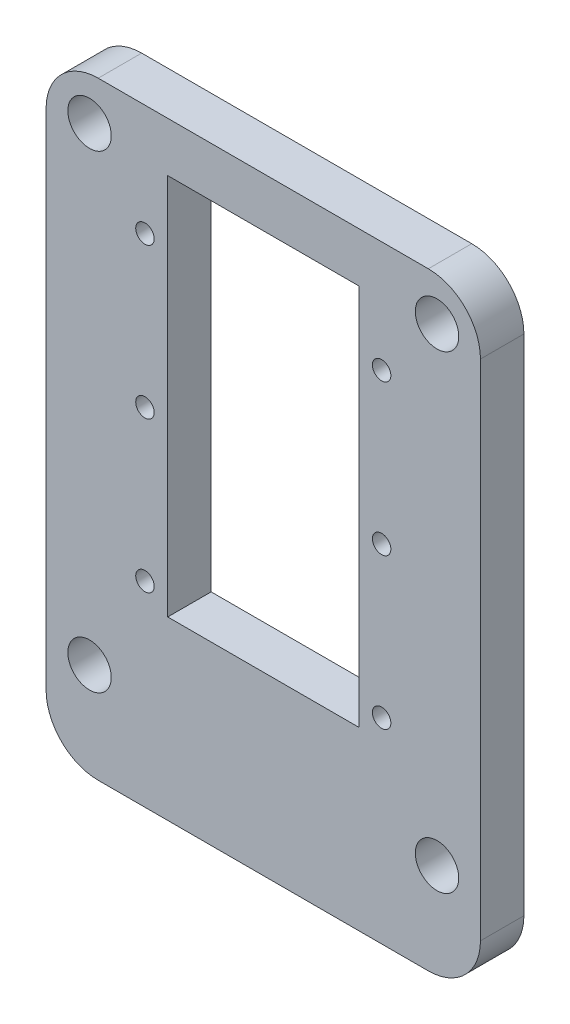
ISO-10303-21;
HEADER;
FILE_DESCRIPTION(('STEP AP214'),'2;1');
FILE_NAME('part.step','',(''),(''),'','','');
FILE_SCHEMA(('AUTOMOTIVE_DESIGN { 1 0 10303 214 1 1 1 1 }'));
ENDSEC;
DATA;
#1=APPLICATION_CONTEXT('core data for automotive mechanical design processes');
#2=APPLICATION_PROTOCOL_DEFINITION('international standard','automotive_design',2000,#1);
#3=PRODUCT_CONTEXT('',#1,'mechanical');
#4=PRODUCT('Part','Part','',(#3));
#5=PRODUCT_RELATED_PRODUCT_CATEGORY('part','',(#4));
#6=PRODUCT_DEFINITION_FORMATION('','',#4);
#7=PRODUCT_DEFINITION_CONTEXT('part definition',#1,'design');
#8=PRODUCT_DEFINITION('design','',#6,#7);
#9=PRODUCT_DEFINITION_SHAPE('','',#8);
#10=(LENGTH_UNIT() NAMED_UNIT(*) SI_UNIT(.MILLI.,.METRE.));
#11=(NAMED_UNIT(*) PLANE_ANGLE_UNIT() SI_UNIT($,.RADIAN.));
#12=(NAMED_UNIT(*) SI_UNIT($,.STERADIAN.) SOLID_ANGLE_UNIT());
#13=UNCERTAINTY_MEASURE_WITH_UNIT(LENGTH_MEASURE(1.E-05),#10,'distance_accuracy_value','');
#14=(GEOMETRIC_REPRESENTATION_CONTEXT(3) GLOBAL_UNCERTAINTY_ASSIGNED_CONTEXT((#13)) GLOBAL_UNIT_ASSIGNED_CONTEXT((#10,
#11,#12)) REPRESENTATION_CONTEXT('',''));
#15=CARTESIAN_POINT('',(0.,0.,0.));
#16=DIRECTION('',(0.,0.,1.));
#17=DIRECTION('',(1.,0.,0.));
#18=AXIS2_PLACEMENT_3D('',#15,#16,#17);
#19=CARTESIAN_POINT('',(-18.1,-22.0973062704397,-6.35));
#20=DIRECTION('',(0.,0.,-1.));
#21=DIRECTION('',(-1.,0.,0.));
#22=AXIS2_PLACEMENT_3D('',#19,#20,#21);
#23=PLANE('',#22);
#24=CARTESIAN_POINT('',(25.4,31.8547845003731,-6.35));
#25=DIRECTION('',(0.,0.,-1.));
#26=DIRECTION('',(-1.,0.,0.));
#27=AXIS2_PLACEMENT_3D('',#24,#25,#26);
#28=CIRCLE('',#27,3.175);
#29=CARTESIAN_POINT('',(22.225,31.8547845003731,-6.35));
#30=VERTEX_POINT('',#29);
#31=EDGE_CURVE('E553',#30,#30,#28,.T.);
#32=ORIENTED_EDGE('',*,*,#31,.F.);
#33=EDGE_LOOP('',(#32));
#34=FACE_BOUND('',#33,.T.);
#35=CARTESIAN_POINT('',(25.3999999999993,-36.7252154996269,-6.35));
#36=DIRECTION('',(0.,0.,-1.));
#37=DIRECTION('',(-1.,0.,0.));
#38=AXIS2_PLACEMENT_3D('',#35,#36,#37);
#39=CIRCLE('',#38,3.175);
#40=CARTESIAN_POINT('',(22.2249999999993,-36.7252154996269,-6.35));
#41=VERTEX_POINT('',#40);
#42=EDGE_CURVE('E562',#41,#41,#39,.T.);
#43=ORIENTED_EDGE('',*,*,#42,.F.);
#44=EDGE_LOOP('',(#43));
#45=FACE_BOUND('',#44,.T.);
#46=CARTESIAN_POINT('',(-25.4000000000007,-36.7252154996265,-6.35));
#47=DIRECTION('',(0.,0.,-1.));
#48=DIRECTION('',(-1.,0.,0.));
#49=AXIS2_PLACEMENT_3D('',#46,#47,#48);
#50=CIRCLE('',#49,3.175);
#51=CARTESIAN_POINT('',(-28.5750000000007,-36.7252154996265,-6.35));
#52=VERTEX_POINT('',#51);
#53=EDGE_CURVE('E568',#52,#52,#50,.T.);
#54=ORIENTED_EDGE('',*,*,#53,.F.);
#55=EDGE_LOOP('',(#54));
#56=FACE_BOUND('',#55,.T.);
#57=CARTESIAN_POINT('',(-25.4,31.8547845003735,-6.35));
#58=DIRECTION('',(0.,0.,-1.));
#59=DIRECTION('',(-1.,0.,0.));
#60=AXIS2_PLACEMENT_3D('',#57,#58,#59);
#61=CIRCLE('',#60,3.175);
#62=CARTESIAN_POINT('',(-28.575,31.8547845003735,-6.35));
#63=VERTEX_POINT('',#62);
#64=EDGE_CURVE('E153',#63,#63,#61,.T.);
#65=ORIENTED_EDGE('',*,*,#64,.F.);
#66=EDGE_LOOP('',(#65));
#67=FACE_BOUND('',#66,.T.);
#68=DIRECTION('',(0.,1.,0.));
#69=VECTOR('',#68,1.);
#70=CARTESIAN_POINT('',(13.97,30.9487845003735,-6.35));
#71=LINE('',#70,#69);
#72=CARTESIAN_POINT('',(13.97,-24.9312154996265,-6.35));
#73=VERTEX_POINT('',#72);
#74=CARTESIAN_POINT('',(13.97,30.9487845003735,-6.35));
#75=VERTEX_POINT('',#74);
#76=EDGE_CURVE('E127',#73,#75,#71,.T.);
#77=ORIENTED_EDGE('',*,*,#76,.T.);
#78=DIRECTION('',(-1.,0.,0.));
#79=VECTOR('',#78,1.);
#80=CARTESIAN_POINT('',(-13.97,30.9487845003735,-6.35));
#81=LINE('',#80,#79);
#82=CARTESIAN_POINT('',(-13.97,30.9487845003735,-6.35));
#83=VERTEX_POINT('',#82);
#84=EDGE_CURVE('E139',#75,#83,#81,.T.);
#85=ORIENTED_EDGE('',*,*,#84,.T.);
#86=DIRECTION('',(0.,-1.,0.));
#87=VECTOR('',#86,1.);
#88=CARTESIAN_POINT('',(-13.97,30.9487845003735,-6.35));
#89=LINE('',#88,#87);
#90=CARTESIAN_POINT('',(-13.97,-24.9312154996265,-6.35));
#91=VERTEX_POINT('',#90);
#92=EDGE_CURVE('E143',#83,#91,#89,.T.);
#93=ORIENTED_EDGE('',*,*,#92,.T.);
#94=DIRECTION('',(1.,0.,0.));
#95=VECTOR('',#94,1.);
#96=CARTESIAN_POINT('',(-13.97,-24.9312154996265,-6.35));
#97=LINE('',#96,#95);
#98=EDGE_CURVE('E135',#91,#73,#97,.T.);
#99=ORIENTED_EDGE('',*,*,#98,.T.);
#100=EDGE_LOOP('',(#77,#85,#93,#99));
#101=FACE_BOUND('',#100,.T.);
#102=CARTESIAN_POINT('',(-17.3,21.9487845003735,-6.35));
#103=DIRECTION('',(0.,0.,-1.));
#104=DIRECTION('',(-1.,0.,0.));
#105=AXIS2_PLACEMENT_3D('',#102,#103,#104);
#106=CIRCLE('',#105,1.35);
#107=CARTESIAN_POINT('',(-18.65,21.9487845003735,-6.35));
#108=VERTEX_POINT('',#107);
#109=EDGE_CURVE('E220',#108,#108,#106,.T.);
#110=ORIENTED_EDGE('',*,*,#109,.F.);
#111=EDGE_LOOP('',(#110));
#112=FACE_BOUND('',#111,.T.);
#113=CARTESIAN_POINT('',(-17.3,-0.0512154996265349,-6.35));
#114=DIRECTION('',(0.,0.,-1.));
#115=DIRECTION('',(-1.,0.,0.));
#116=AXIS2_PLACEMENT_3D('',#113,#114,#115);
#117=CIRCLE('',#116,1.35);
#118=CARTESIAN_POINT('',(-18.65,-0.0512154996265349,-6.35));
#119=VERTEX_POINT('',#118);
#120=EDGE_CURVE('E214',#119,#119,#117,.T.);
#121=ORIENTED_EDGE('',*,*,#120,.F.);
#122=EDGE_LOOP('',(#121));
#123=FACE_BOUND('',#122,.T.);
#124=CARTESIAN_POINT('',(-17.3,-22.0512154996265,-6.35));
#125=DIRECTION('',(0.,0.,-1.));
#126=DIRECTION('',(-1.,0.,0.));
#127=AXIS2_PLACEMENT_3D('',#124,#125,#126);
#128=CIRCLE('',#127,1.35);
#129=CARTESIAN_POINT('',(-18.65,-22.0512154996265,-6.35));
#130=VERTEX_POINT('',#129);
#131=EDGE_CURVE('E208',#130,#130,#128,.T.);
#132=ORIENTED_EDGE('',*,*,#131,.F.);
#133=EDGE_LOOP('',(#132));
#134=FACE_BOUND('',#133,.T.);
#135=CARTESIAN_POINT('',(17.3,-22.0512154996265,-6.35));
#136=DIRECTION('',(0.,0.,-1.));
#137=DIRECTION('',(1.,0.,0.));
#138=AXIS2_PLACEMENT_3D('',#135,#136,#137);
#139=CIRCLE('',#138,1.35);
#140=CARTESIAN_POINT('',(18.65,-22.0512154996265,-6.35));
#141=VERTEX_POINT('',#140);
#142=EDGE_CURVE('E202',#141,#141,#139,.T.);
#143=ORIENTED_EDGE('',*,*,#142,.F.);
#144=EDGE_LOOP('',(#143));
#145=FACE_BOUND('',#144,.T.);
#146=CARTESIAN_POINT('',(17.3,-0.0512154996265349,-6.35));
#147=DIRECTION('',(0.,0.,-1.));
#148=DIRECTION('',(1.,0.,0.));
#149=AXIS2_PLACEMENT_3D('',#146,#147,#148);
#150=CIRCLE('',#149,1.35);
#151=CARTESIAN_POINT('',(18.65,-0.0512154996265349,-6.35));
#152=VERTEX_POINT('',#151);
#153=EDGE_CURVE('E196',#152,#152,#150,.T.);
#154=ORIENTED_EDGE('',*,*,#153,.F.);
#155=EDGE_LOOP('',(#154));
#156=FACE_BOUND('',#155,.T.);
#157=CARTESIAN_POINT('',(17.3,21.9487845003735,-6.35));
#158=DIRECTION('',(0.,0.,-1.));
#159=DIRECTION('',(1.,0.,0.));
#160=AXIS2_PLACEMENT_3D('',#157,#158,#159);
#161=CIRCLE('',#160,1.35);
#162=CARTESIAN_POINT('',(18.65,21.9487845003735,-6.35));
#163=VERTEX_POINT('',#162);
#164=EDGE_CURVE('E182',#163,#163,#161,.T.);
#165=ORIENTED_EDGE('',*,*,#164,.F.);
#166=EDGE_LOOP('',(#165));
#167=FACE_BOUND('',#166,.T.);
#168=DIRECTION('',(-1.,0.,0.));
#169=VECTOR('',#168,1.);
#170=CARTESIAN_POINT('',(31.75,-50.6952154996265,-6.35));
#171=LINE('',#170,#169);
#172=CARTESIAN_POINT('',(24.13,-50.6952154996265,-6.35));
#173=VERTEX_POINT('',#172);
#174=CARTESIAN_POINT('',(-24.13,-50.6952154996265,-6.35));
#175=VERTEX_POINT('',#174);
#176=EDGE_CURVE('E174',#173,#175,#171,.T.);
#177=ORIENTED_EDGE('',*,*,#176,.T.);
#178=CARTESIAN_POINT('',(-24.13,-43.0752154996265,-6.35));
#179=DIRECTION('',(0.,0.,-1.));
#180=DIRECTION('',(-1.,0.,0.));
#181=AXIS2_PLACEMENT_3D('',#178,#179,#180);
#182=CIRCLE('',#181,7.62);
#183=CARTESIAN_POINT('',(-31.75,-43.0752154996265,-6.35));
#184=VERTEX_POINT('',#183);
#185=EDGE_CURVE('E239',#175,#184,#182,.T.);
#186=ORIENTED_EDGE('',*,*,#185,.T.);
#187=DIRECTION('',(0.,1.,0.));
#188=VECTOR('',#187,1.);
#189=CARTESIAN_POINT('',(-31.75,38.2047845003735,-6.35));
#190=LINE('',#189,#188);
#191=CARTESIAN_POINT('',(-31.75,30.5847845003735,-6.35));
#192=VERTEX_POINT('',#191);
#193=EDGE_CURVE('E166',#184,#192,#190,.T.);
#194=ORIENTED_EDGE('',*,*,#193,.T.);
#195=CARTESIAN_POINT('',(-24.13,30.5847845003735,-6.35));
#196=DIRECTION('',(0.,0.,-1.));
#197=DIRECTION('',(-1.,0.,0.));
#198=AXIS2_PLACEMENT_3D('',#195,#196,#197);
#199=CIRCLE('',#198,7.62);
#200=CARTESIAN_POINT('',(-24.13,38.2047845003735,-6.35));
#201=VERTEX_POINT('',#200);
#202=EDGE_CURVE('E235',#192,#201,#199,.T.);
#203=ORIENTED_EDGE('',*,*,#202,.T.);
#204=DIRECTION('',(1.,0.,0.));
#205=VECTOR('',#204,1.);
#206=CARTESIAN_POINT('',(31.75,38.2047845003735,-6.35));
#207=LINE('',#206,#205);
#208=CARTESIAN_POINT('',(24.13,38.2047845003735,-6.35));
#209=VERTEX_POINT('',#208);
#210=EDGE_CURVE('E185',#201,#209,#207,.T.);
#211=ORIENTED_EDGE('',*,*,#210,.T.);
#212=CARTESIAN_POINT('',(24.13,30.5847845003735,-6.35));
#213=DIRECTION('',(0.,0.,-1.));
#214=DIRECTION('',(-1.,0.,0.));
#215=AXIS2_PLACEMENT_3D('',#212,#213,#214);
#216=CIRCLE('',#215,7.62);
#217=CARTESIAN_POINT('',(31.75,30.5847845003735,-6.35));
#218=VERTEX_POINT('',#217);
#219=EDGE_CURVE('E233',#209,#218,#216,.T.);
#220=ORIENTED_EDGE('',*,*,#219,.T.);
#221=DIRECTION('',(0.,-1.,0.));
#222=VECTOR('',#221,1.);
#223=CARTESIAN_POINT('',(31.75,38.2047845003735,-6.35));
#224=LINE('',#223,#222);
#225=CARTESIAN_POINT('',(31.75,-43.0752154996265,-6.35));
#226=VERTEX_POINT('',#225);
#227=EDGE_CURVE('E188',#218,#226,#224,.T.);
#228=ORIENTED_EDGE('',*,*,#227,.T.);
#229=CARTESIAN_POINT('',(24.13,-43.0752154996265,-6.35));
#230=DIRECTION('',(0.,0.,-1.));
#231=DIRECTION('',(-1.,0.,0.));
#232=AXIS2_PLACEMENT_3D('',#229,#230,#231);
#233=CIRCLE('',#232,7.62);
#234=EDGE_CURVE('E237',#226,#173,#233,.T.);
#235=ORIENTED_EDGE('',*,*,#234,.T.);
#236=EDGE_LOOP('',(#177,#186,#194,#203,#211,#220,#228,#235));
#237=FACE_BOUND('',#236,.T.);
#238=ADVANCED_FACE('F34',(#34,#45,#56,#67,#101,#112,#123,#134,#145,#156,#167,#237),#23,.T.);
#239=CARTESIAN_POINT('',(-18.1,-22.0973062704397,0.));
#240=DIRECTION('',(0.,0.,-1.));
#241=DIRECTION('',(-1.,0.,0.));
#242=AXIS2_PLACEMENT_3D('',#239,#240,#241);
#243=PLANE('',#242);
#244=CARTESIAN_POINT('',(25.4,31.8547845003731,0.));
#245=DIRECTION('',(0.,0.,-1.));
#246=DIRECTION('',(-1.,0.,0.));
#247=AXIS2_PLACEMENT_3D('',#244,#245,#246);
#248=CIRCLE('',#247,3.175);
#249=CARTESIAN_POINT('',(22.225,31.8547845003731,0.));
#250=VERTEX_POINT('',#249);
#251=EDGE_CURVE('E551',#250,#250,#248,.T.);
#252=ORIENTED_EDGE('',*,*,#251,.T.);
#253=EDGE_LOOP('',(#252));
#254=FACE_BOUND('',#253,.T.);
#255=CARTESIAN_POINT('',(25.3999999999993,-36.7252154996269,0.));
#256=DIRECTION('',(0.,0.,-1.));
#257=DIRECTION('',(-1.,0.,0.));
#258=AXIS2_PLACEMENT_3D('',#255,#256,#257);
#259=CIRCLE('',#258,3.175);
#260=CARTESIAN_POINT('',(22.2249999999993,-36.7252154996269,0.));
#261=VERTEX_POINT('',#260);
#262=EDGE_CURVE('E557',#261,#261,#259,.T.);
#263=ORIENTED_EDGE('',*,*,#262,.T.);
#264=EDGE_LOOP('',(#263));
#265=FACE_BOUND('',#264,.T.);
#266=CARTESIAN_POINT('',(-25.4000000000007,-36.7252154996265,0.));
#267=DIRECTION('',(0.,0.,-1.));
#268=DIRECTION('',(-1.,0.,0.));
#269=AXIS2_PLACEMENT_3D('',#266,#267,#268);
#270=CIRCLE('',#269,3.175);
#271=CARTESIAN_POINT('',(-28.5750000000007,-36.7252154996265,0.));
#272=VERTEX_POINT('',#271);
#273=EDGE_CURVE('E565',#272,#272,#270,.T.);
#274=ORIENTED_EDGE('',*,*,#273,.T.);
#275=EDGE_LOOP('',(#274));
#276=FACE_BOUND('',#275,.T.);
#277=CARTESIAN_POINT('',(-25.4,31.8547845003735,0.));
#278=DIRECTION('',(0.,0.,-1.));
#279=DIRECTION('',(-1.,0.,0.));
#280=AXIS2_PLACEMENT_3D('',#277,#278,#279);
#281=CIRCLE('',#280,3.175);
#282=CARTESIAN_POINT('',(-28.575,31.8547845003735,0.));
#283=VERTEX_POINT('',#282);
#284=EDGE_CURVE('E160',#283,#283,#281,.T.);
#285=ORIENTED_EDGE('',*,*,#284,.T.);
#286=EDGE_LOOP('',(#285));
#287=FACE_BOUND('',#286,.T.);
#288=DIRECTION('',(-1.,0.,0.));
#289=VECTOR('',#288,1.);
#290=CARTESIAN_POINT('',(-13.97,30.9487845003735,0.));
#291=LINE('',#290,#289);
#292=CARTESIAN_POINT('',(13.97,30.9487845003735,0.));
#293=VERTEX_POINT('',#292);
#294=CARTESIAN_POINT('',(-13.97,30.9487845003735,0.));
#295=VERTEX_POINT('',#294);
#296=EDGE_CURVE('E159',#293,#295,#291,.T.);
#297=ORIENTED_EDGE('',*,*,#296,.F.);
#298=DIRECTION('',(0.,1.,0.));
#299=VECTOR('',#298,1.);
#300=CARTESIAN_POINT('',(13.97,30.9487845003735,0.));
#301=LINE('',#300,#299);
#302=CARTESIAN_POINT('',(13.97,-24.9312154996265,0.));
#303=VERTEX_POINT('',#302);
#304=EDGE_CURVE('E130',#303,#293,#301,.T.);
#305=ORIENTED_EDGE('',*,*,#304,.F.);
#306=DIRECTION('',(1.,0.,0.));
#307=VECTOR('',#306,1.);
#308=CARTESIAN_POINT('',(-13.97,-24.9312154996265,0.));
#309=LINE('',#308,#307);
#310=CARTESIAN_POINT('',(-13.97,-24.9312154996265,0.));
#311=VERTEX_POINT('',#310);
#312=EDGE_CURVE('E147',#311,#303,#309,.T.);
#313=ORIENTED_EDGE('',*,*,#312,.F.);
#314=DIRECTION('',(0.,-1.,0.));
#315=VECTOR('',#314,1.);
#316=CARTESIAN_POINT('',(-13.97,30.9487845003735,0.));
#317=LINE('',#316,#315);
#318=EDGE_CURVE('E150',#295,#311,#317,.T.);
#319=ORIENTED_EDGE('',*,*,#318,.F.);
#320=EDGE_LOOP('',(#297,#305,#313,#319));
#321=FACE_BOUND('',#320,.T.);
#322=CARTESIAN_POINT('',(-17.3,21.9487845003735,0.));
#323=DIRECTION('',(0.,0.,-1.));
#324=DIRECTION('',(-1.,0.,0.));
#325=AXIS2_PLACEMENT_3D('',#322,#323,#324);
#326=CIRCLE('',#325,1.35);
#327=CARTESIAN_POINT('',(-18.65,21.9487845003735,0.));
#328=VERTEX_POINT('',#327);
#329=EDGE_CURVE('E223',#328,#328,#326,.T.);
#330=ORIENTED_EDGE('',*,*,#329,.T.);
#331=EDGE_LOOP('',(#330));
#332=FACE_BOUND('',#331,.T.);
#333=CARTESIAN_POINT('',(-17.3,-0.0512154996265349,0.));
#334=DIRECTION('',(0.,0.,-1.));
#335=DIRECTION('',(-1.,0.,0.));
#336=AXIS2_PLACEMENT_3D('',#333,#334,#335);
#337=CIRCLE('',#336,1.35);
#338=CARTESIAN_POINT('',(-18.65,-0.0512154996265349,0.));
#339=VERTEX_POINT('',#338);
#340=EDGE_CURVE('E217',#339,#339,#337,.T.);
#341=ORIENTED_EDGE('',*,*,#340,.T.);
#342=EDGE_LOOP('',(#341));
#343=FACE_BOUND('',#342,.T.);
#344=CARTESIAN_POINT('',(-17.3,-22.0512154996265,0.));
#345=DIRECTION('',(0.,0.,-1.));
#346=DIRECTION('',(-1.,0.,0.));
#347=AXIS2_PLACEMENT_3D('',#344,#345,#346);
#348=CIRCLE('',#347,1.35);
#349=CARTESIAN_POINT('',(-18.65,-22.0512154996265,0.));
#350=VERTEX_POINT('',#349);
#351=EDGE_CURVE('E211',#350,#350,#348,.T.);
#352=ORIENTED_EDGE('',*,*,#351,.T.);
#353=EDGE_LOOP('',(#352));
#354=FACE_BOUND('',#353,.T.);
#355=CARTESIAN_POINT('',(17.3,-22.0512154996265,0.));
#356=DIRECTION('',(0.,0.,-1.));
#357=DIRECTION('',(1.,0.,0.));
#358=AXIS2_PLACEMENT_3D('',#355,#356,#357);
#359=CIRCLE('',#358,1.35);
#360=CARTESIAN_POINT('',(18.65,-22.0512154996265,0.));
#361=VERTEX_POINT('',#360);
#362=EDGE_CURVE('E205',#361,#361,#359,.T.);
#363=ORIENTED_EDGE('',*,*,#362,.T.);
#364=EDGE_LOOP('',(#363));
#365=FACE_BOUND('',#364,.T.);
#366=CARTESIAN_POINT('',(17.3,-0.0512154996265349,0.));
#367=DIRECTION('',(0.,0.,-1.));
#368=DIRECTION('',(1.,0.,0.));
#369=AXIS2_PLACEMENT_3D('',#366,#367,#368);
#370=CIRCLE('',#369,1.35);
#371=CARTESIAN_POINT('',(18.65,-0.0512154996265349,0.));
#372=VERTEX_POINT('',#371);
#373=EDGE_CURVE('E199',#372,#372,#370,.T.);
#374=ORIENTED_EDGE('',*,*,#373,.T.);
#375=EDGE_LOOP('',(#374));
#376=FACE_BOUND('',#375,.T.);
#377=CARTESIAN_POINT('',(17.3,21.9487845003735,0.));
#378=DIRECTION('',(0.,0.,-1.));
#379=DIRECTION('',(1.,0.,0.));
#380=AXIS2_PLACEMENT_3D('',#377,#378,#379);
#381=CIRCLE('',#380,1.35);
#382=CARTESIAN_POINT('',(18.65,21.9487845003735,0.));
#383=VERTEX_POINT('',#382);
#384=EDGE_CURVE('E193',#383,#383,#381,.T.);
#385=ORIENTED_EDGE('',*,*,#384,.T.);
#386=EDGE_LOOP('',(#385));
#387=FACE_BOUND('',#386,.T.);
#388=DIRECTION('',(0.,1.,0.));
#389=VECTOR('',#388,1.);
#390=CARTESIAN_POINT('',(-31.75,38.2047845003735,0.));
#391=LINE('',#390,#389);
#392=CARTESIAN_POINT('',(-31.75,-43.0752154996265,0.));
#393=VERTEX_POINT('',#392);
#394=CARTESIAN_POINT('',(-31.75,30.5847845003735,0.));
#395=VERTEX_POINT('',#394);
#396=EDGE_CURVE('E170',#393,#395,#391,.T.);
#397=ORIENTED_EDGE('',*,*,#396,.F.);
#398=CARTESIAN_POINT('',(-24.13,-43.0752154996265,0.));
#399=DIRECTION('',(0.,0.,-1.));
#400=DIRECTION('',(-1.,0.,0.));
#401=AXIS2_PLACEMENT_3D('',#398,#399,#400);
#402=CIRCLE('',#401,7.62);
#403=CARTESIAN_POINT('',(-24.13,-50.6952154996265,0.));
#404=VERTEX_POINT('',#403);
#405=EDGE_CURVE('E251',#393,#404,#402,.F.);
#406=ORIENTED_EDGE('',*,*,#405,.T.);
#407=DIRECTION('',(-1.,0.,0.));
#408=VECTOR('',#407,1.);
#409=CARTESIAN_POINT('',(31.75,-50.6952154996265,0.));
#410=LINE('',#409,#408);
#411=CARTESIAN_POINT('',(24.13,-50.6952154996265,0.));
#412=VERTEX_POINT('',#411);
#413=EDGE_CURVE('E179',#412,#404,#410,.T.);
#414=ORIENTED_EDGE('',*,*,#413,.F.);
#415=CARTESIAN_POINT('',(24.13,-43.0752154996265,0.));
#416=DIRECTION('',(0.,0.,-1.));
#417=DIRECTION('',(-1.,0.,0.));
#418=AXIS2_PLACEMENT_3D('',#415,#416,#417);
#419=CIRCLE('',#418,7.62);
#420=CARTESIAN_POINT('',(31.75,-43.0752154996265,0.));
#421=VERTEX_POINT('',#420);
#422=EDGE_CURVE('E249',#412,#421,#419,.F.);
#423=ORIENTED_EDGE('',*,*,#422,.T.);
#424=DIRECTION('',(0.,-1.,0.));
#425=VECTOR('',#424,1.);
#426=CARTESIAN_POINT('',(31.75,38.2047845003735,0.));
#427=LINE('',#426,#425);
#428=CARTESIAN_POINT('',(31.75,30.5847845003735,0.));
#429=VERTEX_POINT('',#428);
#430=EDGE_CURVE('E176',#429,#421,#427,.T.);
#431=ORIENTED_EDGE('',*,*,#430,.F.);
#432=CARTESIAN_POINT('',(24.13,30.5847845003735,0.));
#433=DIRECTION('',(0.,0.,-1.));
#434=DIRECTION('',(-1.,0.,0.));
#435=AXIS2_PLACEMENT_3D('',#432,#433,#434);
#436=CIRCLE('',#435,7.62);
#437=CARTESIAN_POINT('',(24.13,38.2047845003735,0.));
#438=VERTEX_POINT('',#437);
#439=EDGE_CURVE('E49',#429,#438,#436,.F.);
#440=ORIENTED_EDGE('',*,*,#439,.T.);
#441=DIRECTION('',(1.,0.,0.));
#442=VECTOR('',#441,1.);
#443=CARTESIAN_POINT('',(31.75,38.2047845003735,0.));
#444=LINE('',#443,#442);
#445=CARTESIAN_POINT('',(-24.13,38.2047845003735,0.));
#446=VERTEX_POINT('',#445);
#447=EDGE_CURVE('E173',#446,#438,#444,.T.);
#448=ORIENTED_EDGE('',*,*,#447,.F.);
#449=CARTESIAN_POINT('',(-24.13,30.5847845003735,0.));
#450=DIRECTION('',(0.,0.,-1.));
#451=DIRECTION('',(-1.,0.,0.));
#452=AXIS2_PLACEMENT_3D('',#449,#450,#451);
#453=CIRCLE('',#452,7.62);
#454=EDGE_CURVE('E247',#446,#395,#453,.F.);
#455=ORIENTED_EDGE('',*,*,#454,.T.);
#456=EDGE_LOOP('',(#397,#406,#414,#423,#431,#440,#448,#455));
#457=FACE_BOUND('',#456,.T.);
#458=ADVANCED_FACE('F273',(#254,#265,#276,#287,#321,#332,#343,#354,#365,#376,#387,#457),#243,.F.);
#459=CARTESIAN_POINT('',(-17.3,21.9487845003735,0.));
#460=DIRECTION('',(0.,0.,-1.));
#461=DIRECTION('',(-1.,0.,0.));
#462=AXIS2_PLACEMENT_3D('',#459,#460,#461);
#463=CYLINDRICAL_SURFACE('',#462,1.35);
#464=ORIENTED_EDGE('',*,*,#329,.F.);
#465=EDGE_LOOP('',(#464));
#466=FACE_BOUND('',#465,.T.);
#467=ORIENTED_EDGE('',*,*,#109,.T.);
#468=EDGE_LOOP('',(#467));
#469=FACE_BOUND('',#468,.T.);
#470=ADVANCED_FACE('F299',(#466,#469),#463,.F.);
#471=CARTESIAN_POINT('',(-17.3,-0.0512154996265349,0.));
#472=DIRECTION('',(0.,0.,-1.));
#473=DIRECTION('',(-1.,0.,0.));
#474=AXIS2_PLACEMENT_3D('',#471,#472,#473);
#475=CYLINDRICAL_SURFACE('',#474,1.35);
#476=ORIENTED_EDGE('',*,*,#340,.F.);
#477=EDGE_LOOP('',(#476));
#478=FACE_BOUND('',#477,.T.);
#479=ORIENTED_EDGE('',*,*,#120,.T.);
#480=EDGE_LOOP('',(#479));
#481=FACE_BOUND('',#480,.T.);
#482=ADVANCED_FACE('F478',(#478,#481),#475,.F.);
#483=CARTESIAN_POINT('',(-17.3,-22.0512154996265,0.));
#484=DIRECTION('',(0.,0.,-1.));
#485=DIRECTION('',(-1.,0.,0.));
#486=AXIS2_PLACEMENT_3D('',#483,#484,#485);
#487=CYLINDRICAL_SURFACE('',#486,1.35);
#488=ORIENTED_EDGE('',*,*,#351,.F.);
#489=EDGE_LOOP('',(#488));
#490=FACE_BOUND('',#489,.T.);
#491=ORIENTED_EDGE('',*,*,#131,.T.);
#492=EDGE_LOOP('',(#491));
#493=FACE_BOUND('',#492,.T.);
#494=ADVANCED_FACE('F469',(#490,#493),#487,.F.);
#495=CARTESIAN_POINT('',(17.3,-22.0512154996265,0.));
#496=DIRECTION('',(0.,0.,-1.));
#497=DIRECTION('',(-1.,0.,0.));
#498=AXIS2_PLACEMENT_3D('',#495,#496,#497);
#499=CYLINDRICAL_SURFACE('',#498,1.35);
#500=ORIENTED_EDGE('',*,*,#362,.F.);
#501=EDGE_LOOP('',(#500));
#502=FACE_BOUND('',#501,.T.);
#503=ORIENTED_EDGE('',*,*,#142,.T.);
#504=EDGE_LOOP('',(#503));
#505=FACE_BOUND('',#504,.T.);
#506=ADVANCED_FACE('F460',(#502,#505),#499,.F.);
#507=CARTESIAN_POINT('',(17.3,-0.0512154996265349,0.));
#508=DIRECTION('',(0.,0.,-1.));
#509=DIRECTION('',(-1.,0.,0.));
#510=AXIS2_PLACEMENT_3D('',#507,#508,#509);
#511=CYLINDRICAL_SURFACE('',#510,1.35);
#512=ORIENTED_EDGE('',*,*,#373,.F.);
#513=EDGE_LOOP('',(#512));
#514=FACE_BOUND('',#513,.T.);
#515=ORIENTED_EDGE('',*,*,#153,.T.);
#516=EDGE_LOOP('',(#515));
#517=FACE_BOUND('',#516,.T.);
#518=ADVANCED_FACE('F451',(#514,#517),#511,.F.);
#519=CARTESIAN_POINT('',(17.3,21.9487845003735,0.));
#520=DIRECTION('',(0.,0.,-1.));
#521=DIRECTION('',(-1.,0.,0.));
#522=AXIS2_PLACEMENT_3D('',#519,#520,#521);
#523=CYLINDRICAL_SURFACE('',#522,1.35);
#524=ORIENTED_EDGE('',*,*,#384,.F.);
#525=EDGE_LOOP('',(#524));
#526=FACE_BOUND('',#525,.T.);
#527=ORIENTED_EDGE('',*,*,#164,.T.);
#528=EDGE_LOOP('',(#527));
#529=FACE_BOUND('',#528,.T.);
#530=ADVANCED_FACE('F428',(#526,#529),#523,.F.);
#531=CARTESIAN_POINT('',(-31.75,38.2047845003735,0.));
#532=DIRECTION('',(-1.,0.,0.));
#533=DIRECTION('',(0.,-1.,0.));
#534=AXIS2_PLACEMENT_3D('',#531,#532,#533);
#535=PLANE('',#534);
#536=ORIENTED_EDGE('',*,*,#193,.F.);
#537=DIRECTION('',(0.,0.,-1.));
#538=VECTOR('',#537,1.);
#539=CARTESIAN_POINT('',(-31.75,-43.0752154996265,0.));
#540=LINE('',#539,#538);
#541=EDGE_CURVE('E244',#184,#393,#540,.F.);
#542=ORIENTED_EDGE('',*,*,#541,.T.);
#543=ORIENTED_EDGE('',*,*,#396,.T.);
#544=DIRECTION('',(0.,0.,-1.));
#545=VECTOR('',#544,1.);
#546=CARTESIAN_POINT('',(-31.75,30.5847845003735,0.));
#547=LINE('',#546,#545);
#548=EDGE_CURVE('E241',#395,#192,#547,.T.);
#549=ORIENTED_EDGE('',*,*,#548,.T.);
#550=EDGE_LOOP('',(#536,#542,#543,#549));
#551=FACE_BOUND('',#550,.T.);
#552=ADVANCED_FACE('F269',(#551),#535,.T.);
#553=CARTESIAN_POINT('',(31.75,-50.6952154996265,0.));
#554=DIRECTION('',(0.,-1.,0.));
#555=DIRECTION('',(1.,0.,0.));
#556=AXIS2_PLACEMENT_3D('',#553,#554,#555);
#557=PLANE('',#556);
#558=ORIENTED_EDGE('',*,*,#413,.T.);
#559=DIRECTION('',(0.,0.,-1.));
#560=VECTOR('',#559,1.);
#561=CARTESIAN_POINT('',(-24.13,-50.6952154996265,0.));
#562=LINE('',#561,#560);
#563=EDGE_CURVE('E230',#404,#175,#562,.T.);
#564=ORIENTED_EDGE('',*,*,#563,.T.);
#565=ORIENTED_EDGE('',*,*,#176,.F.);
#566=DIRECTION('',(0.,0.,-1.));
#567=VECTOR('',#566,1.);
#568=CARTESIAN_POINT('',(24.13,-50.6952154996265,0.));
#569=LINE('',#568,#567);
#570=EDGE_CURVE('E226',#173,#412,#569,.F.);
#571=ORIENTED_EDGE('',*,*,#570,.T.);
#572=EDGE_LOOP('',(#558,#564,#565,#571));
#573=FACE_BOUND('',#572,.T.);
#574=ADVANCED_FACE('F280',(#573),#557,.T.);
#575=CARTESIAN_POINT('',(31.75,38.2047845003735,0.));
#576=DIRECTION('',(1.,0.,0.));
#577=DIRECTION('',(0.,1.,0.));
#578=AXIS2_PLACEMENT_3D('',#575,#576,#577);
#579=PLANE('',#578);
#580=ORIENTED_EDGE('',*,*,#430,.T.);
#581=DIRECTION('',(0.,0.,-1.));
#582=VECTOR('',#581,1.);
#583=CARTESIAN_POINT('',(31.75,-43.0752154996265,0.));
#584=LINE('',#583,#582);
#585=EDGE_CURVE('E255',#421,#226,#584,.T.);
#586=ORIENTED_EDGE('',*,*,#585,.T.);
#587=ORIENTED_EDGE('',*,*,#227,.F.);
#588=DIRECTION('',(0.,0.,-1.));
#589=VECTOR('',#588,1.);
#590=CARTESIAN_POINT('',(31.75,30.5847845003735,0.));
#591=LINE('',#590,#589);
#592=EDGE_CURVE('E253',#218,#429,#591,.F.);
#593=ORIENTED_EDGE('',*,*,#592,.T.);
#594=EDGE_LOOP('',(#580,#586,#587,#593));
#595=FACE_BOUND('',#594,.T.);
#596=ADVANCED_FACE('F287',(#595),#579,.T.);
#597=CARTESIAN_POINT('',(31.75,38.2047845003735,0.));
#598=DIRECTION('',(0.,1.,0.));
#599=DIRECTION('',(0.,0.,1.));
#600=AXIS2_PLACEMENT_3D('',#597,#598,#599);
#601=PLANE('',#600);
#602=ORIENTED_EDGE('',*,*,#210,.F.);
#603=DIRECTION('',(0.,0.,-1.));
#604=VECTOR('',#603,1.);
#605=CARTESIAN_POINT('',(-24.13,38.2047845003735,0.));
#606=LINE('',#605,#604);
#607=EDGE_CURVE('E11',#201,#446,#606,.F.);
#608=ORIENTED_EDGE('',*,*,#607,.T.);
#609=ORIENTED_EDGE('',*,*,#447,.T.);
#610=DIRECTION('',(0.,0.,-1.));
#611=VECTOR('',#610,1.);
#612=CARTESIAN_POINT('',(24.13,38.2047845003735,0.));
#613=LINE('',#612,#611);
#614=EDGE_CURVE('E42',#438,#209,#613,.T.);
#615=ORIENTED_EDGE('',*,*,#614,.T.);
#616=EDGE_LOOP('',(#602,#608,#609,#615));
#617=FACE_BOUND('',#616,.T.);
#618=ADVANCED_FACE('F259',(#617),#601,.T.);
#619=CARTESIAN_POINT('',(13.97,30.9487845003735,-6.35));
#620=DIRECTION('',(1.,0.,0.));
#621=DIRECTION('',(0.,1.,0.));
#622=AXIS2_PLACEMENT_3D('',#619,#620,#621);
#623=PLANE('',#622);
#624=ORIENTED_EDGE('',*,*,#304,.T.);
#625=DIRECTION('',(0.,0.,1.));
#626=VECTOR('',#625,1.);
#627=CARTESIAN_POINT('',(13.97,30.9487845003735,-6.35));
#628=LINE('',#627,#626);
#629=EDGE_CURVE('E123',#75,#293,#628,.T.);
#630=ORIENTED_EDGE('',*,*,#629,.F.);
#631=ORIENTED_EDGE('',*,*,#76,.F.);
#632=DIRECTION('',(0.,0.,1.));
#633=VECTOR('',#632,1.);
#634=CARTESIAN_POINT('',(13.97,-24.9312154996265,-6.35));
#635=LINE('',#634,#633);
#636=EDGE_CURVE('E164',#73,#303,#635,.T.);
#637=ORIENTED_EDGE('',*,*,#636,.T.);
#638=EDGE_LOOP('',(#624,#630,#631,#637));
#639=FACE_BOUND('',#638,.T.);
#640=ADVANCED_FACE('F125',(#639),#623,.F.);
#641=CARTESIAN_POINT('',(-13.97,-24.9312154996265,-6.35));
#642=DIRECTION('',(0.,-1.,0.));
#643=DIRECTION('',(0.,0.,-1.));
#644=AXIS2_PLACEMENT_3D('',#641,#642,#643);
#645=PLANE('',#644);
#646=ORIENTED_EDGE('',*,*,#312,.T.);
#647=ORIENTED_EDGE('',*,*,#636,.F.);
#648=ORIENTED_EDGE('',*,*,#98,.F.);
#649=DIRECTION('',(0.,0.,1.));
#650=VECTOR('',#649,1.);
#651=CARTESIAN_POINT('',(-13.97,-24.9312154996265,-6.35));
#652=LINE('',#651,#650);
#653=EDGE_CURVE('E167',#91,#311,#652,.T.);
#654=ORIENTED_EDGE('',*,*,#653,.T.);
#655=EDGE_LOOP('',(#646,#647,#648,#654));
#656=FACE_BOUND('',#655,.T.);
#657=ADVANCED_FACE('F383',(#656),#645,.F.);
#658=CARTESIAN_POINT('',(-13.97,30.9487845003735,-6.35));
#659=DIRECTION('',(-1.,0.,0.));
#660=DIRECTION('',(0.,-1.,0.));
#661=AXIS2_PLACEMENT_3D('',#658,#659,#660);
#662=PLANE('',#661);
#663=ORIENTED_EDGE('',*,*,#318,.T.);
#664=ORIENTED_EDGE('',*,*,#653,.F.);
#665=ORIENTED_EDGE('',*,*,#92,.F.);
#666=DIRECTION('',(0.,0.,1.));
#667=VECTOR('',#666,1.);
#668=CARTESIAN_POINT('',(-13.97,30.9487845003735,-6.35));
#669=LINE('',#668,#667);
#670=EDGE_CURVE('E134',#83,#295,#669,.T.);
#671=ORIENTED_EDGE('',*,*,#670,.T.);
#672=EDGE_LOOP('',(#663,#664,#665,#671));
#673=FACE_BOUND('',#672,.T.);
#674=ADVANCED_FACE('F375',(#673),#662,.F.);
#675=CARTESIAN_POINT('',(-13.97,30.9487845003735,-6.35));
#676=DIRECTION('',(0.,1.,0.));
#677=DIRECTION('',(0.,0.,1.));
#678=AXIS2_PLACEMENT_3D('',#675,#676,#677);
#679=PLANE('',#678);
#680=ORIENTED_EDGE('',*,*,#296,.T.);
#681=ORIENTED_EDGE('',*,*,#670,.F.);
#682=ORIENTED_EDGE('',*,*,#84,.F.);
#683=ORIENTED_EDGE('',*,*,#629,.T.);
#684=EDGE_LOOP('',(#680,#681,#682,#683));
#685=FACE_BOUND('',#684,.T.);
#686=ADVANCED_FACE('F140',(#685),#679,.F.);
#687=CARTESIAN_POINT('',(-25.4,31.8547845003735,0.));
#688=DIRECTION('',(0.,0.,-1.));
#689=DIRECTION('',(-1.,0.,0.));
#690=AXIS2_PLACEMENT_3D('',#687,#688,#689);
#691=CYLINDRICAL_SURFACE('',#690,3.175);
#692=ORIENTED_EDGE('',*,*,#284,.F.);
#693=EDGE_LOOP('',(#692));
#694=FACE_BOUND('',#693,.T.);
#695=ORIENTED_EDGE('',*,*,#64,.T.);
#696=EDGE_LOOP('',(#695));
#697=FACE_BOUND('',#696,.T.);
#698=ADVANCED_FACE('F358',(#694,#697),#691,.F.);
#699=CARTESIAN_POINT('',(-25.4000000000007,-36.7252154996265,0.));
#700=DIRECTION('',(0.,0.,-1.));
#701=DIRECTION('',(-1.,0.,0.));
#702=AXIS2_PLACEMENT_3D('',#699,#700,#701);
#703=CYLINDRICAL_SURFACE('',#702,3.175);
#704=ORIENTED_EDGE('',*,*,#273,.F.);
#705=EDGE_LOOP('',(#704));
#706=FACE_BOUND('',#705,.T.);
#707=ORIENTED_EDGE('',*,*,#53,.T.);
#708=EDGE_LOOP('',(#707));
#709=FACE_BOUND('',#708,.T.);
#710=ADVANCED_FACE('F349',(#706,#709),#703,.F.);
#711=CARTESIAN_POINT('',(25.3999999999993,-36.7252154996269,0.));
#712=DIRECTION('',(0.,0.,-1.));
#713=DIRECTION('',(-1.,0.,0.));
#714=AXIS2_PLACEMENT_3D('',#711,#712,#713);
#715=CYLINDRICAL_SURFACE('',#714,3.175);
#716=ORIENTED_EDGE('',*,*,#262,.F.);
#717=EDGE_LOOP('',(#716));
#718=FACE_BOUND('',#717,.T.);
#719=ORIENTED_EDGE('',*,*,#42,.T.);
#720=EDGE_LOOP('',(#719));
#721=FACE_BOUND('',#720,.T.);
#722=ADVANCED_FACE('F340',(#718,#721),#715,.F.);
#723=CARTESIAN_POINT('',(25.4,31.8547845003731,0.));
#724=DIRECTION('',(0.,0.,-1.));
#725=DIRECTION('',(-1.,0.,0.));
#726=AXIS2_PLACEMENT_3D('',#723,#724,#725);
#727=CYLINDRICAL_SURFACE('',#726,3.175);
#728=ORIENTED_EDGE('',*,*,#251,.F.);
#729=EDGE_LOOP('',(#728));
#730=FACE_BOUND('',#729,.T.);
#731=ORIENTED_EDGE('',*,*,#31,.T.);
#732=EDGE_LOOP('',(#731));
#733=FACE_BOUND('',#732,.T.);
#734=ADVANCED_FACE('F309',(#730,#733),#727,.F.);
#735=CARTESIAN_POINT('',(-24.13,-43.0752154996265,0.));
#736=DIRECTION('',(0.,0.,-1.));
#737=DIRECTION('',(-1.,0.,0.));
#738=AXIS2_PLACEMENT_3D('',#735,#736,#737);
#739=CYLINDRICAL_SURFACE('',#738,7.62);
#740=ORIENTED_EDGE('',*,*,#405,.F.);
#741=ORIENTED_EDGE('',*,*,#541,.F.);
#742=ORIENTED_EDGE('',*,*,#185,.F.);
#743=ORIENTED_EDGE('',*,*,#563,.F.);
#744=EDGE_LOOP('',(#740,#741,#742,#743));
#745=FACE_BOUND('',#744,.T.);
#746=ADVANCED_FACE('F277',(#745),#739,.T.);
#747=CARTESIAN_POINT('',(24.13,-43.0752154996265,0.));
#748=DIRECTION('',(0.,0.,-1.));
#749=DIRECTION('',(-1.,0.,0.));
#750=AXIS2_PLACEMENT_3D('',#747,#748,#749);
#751=CYLINDRICAL_SURFACE('',#750,7.62);
#752=ORIENTED_EDGE('',*,*,#422,.F.);
#753=ORIENTED_EDGE('',*,*,#570,.F.);
#754=ORIENTED_EDGE('',*,*,#234,.F.);
#755=ORIENTED_EDGE('',*,*,#585,.F.);
#756=EDGE_LOOP('',(#752,#753,#754,#755));
#757=FACE_BOUND('',#756,.T.);
#758=ADVANCED_FACE('F285',(#757),#751,.T.);
#759=CARTESIAN_POINT('',(-24.13,30.5847845003735,0.));
#760=DIRECTION('',(0.,0.,-1.));
#761=DIRECTION('',(-1.,0.,0.));
#762=AXIS2_PLACEMENT_3D('',#759,#760,#761);
#763=CYLINDRICAL_SURFACE('',#762,7.62);
#764=ORIENTED_EDGE('',*,*,#454,.F.);
#765=ORIENTED_EDGE('',*,*,#607,.F.);
#766=ORIENTED_EDGE('',*,*,#202,.F.);
#767=ORIENTED_EDGE('',*,*,#548,.F.);
#768=EDGE_LOOP('',(#764,#765,#766,#767));
#769=FACE_BOUND('',#768,.T.);
#770=ADVANCED_FACE('F267',(#769),#763,.T.);
#771=CARTESIAN_POINT('',(24.13,30.5847845003735,0.));
#772=DIRECTION('',(0.,0.,-1.));
#773=DIRECTION('',(-1.,0.,0.));
#774=AXIS2_PLACEMENT_3D('',#771,#772,#773);
#775=CYLINDRICAL_SURFACE('',#774,7.62);
#776=ORIENTED_EDGE('',*,*,#439,.F.);
#777=ORIENTED_EDGE('',*,*,#592,.F.);
#778=ORIENTED_EDGE('',*,*,#219,.F.);
#779=ORIENTED_EDGE('',*,*,#614,.F.);
#780=EDGE_LOOP('',(#776,#777,#778,#779));
#781=FACE_BOUND('',#780,.T.);
#782=ADVANCED_FACE('F36',(#781),#775,.T.);
#783=CLOSED_SHELL('',(#238,#458,#470,#482,#494,#506,#518,#530,#552,#574,#596,#618,#640,#657,
#674,#686,#698,#710,#722,#734,#746,#758,#770,#782));
#784=MANIFOLD_SOLID_BREP('B2',#783);
#785=ADVANCED_BREP_SHAPE_REPRESENTATION('',(#18,#784),#14);
#786=SHAPE_DEFINITION_REPRESENTATION(#9,#785);
ENDSEC;
END-ISO-10303-21;
